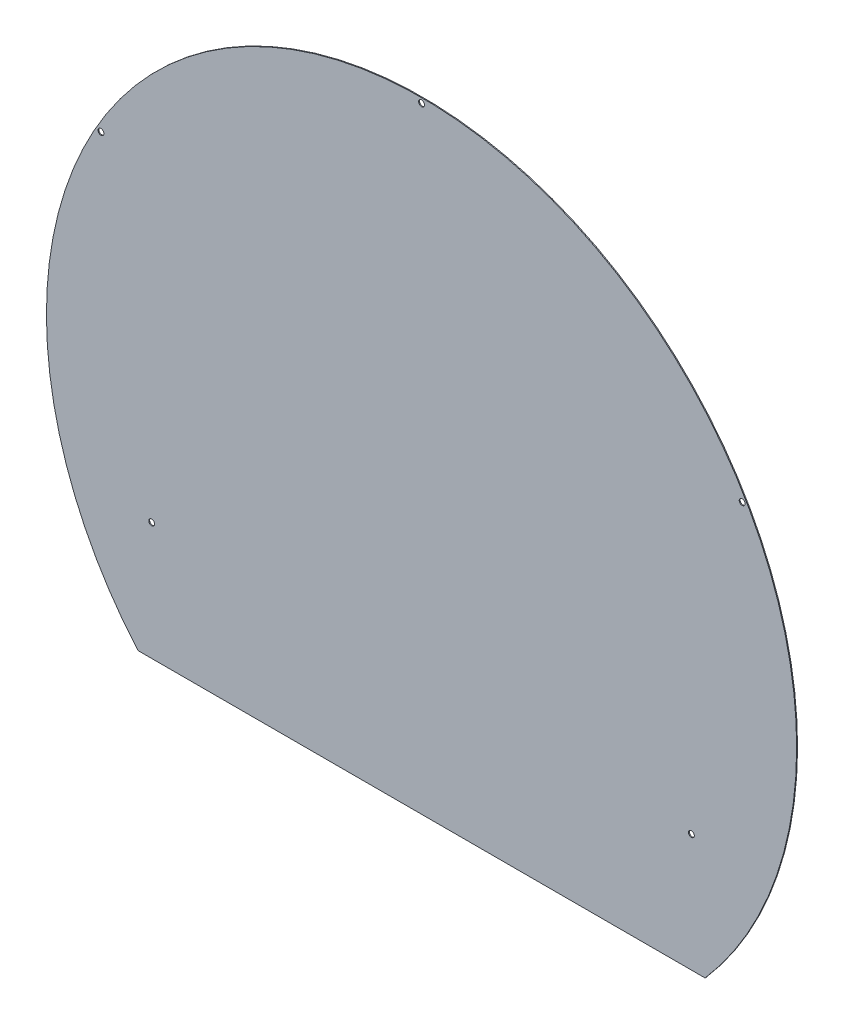
ISO-10303-21;
HEADER;
FILE_DESCRIPTION(('STEP AP214'),'2;1');
FILE_NAME('part.step','',(''),(''),'','','');
FILE_SCHEMA(('AUTOMOTIVE_DESIGN { 1 0 10303 214 1 1 1 1 }'));
ENDSEC;
DATA;
#1=APPLICATION_CONTEXT('core data for automotive mechanical design processes');
#2=APPLICATION_PROTOCOL_DEFINITION('international standard','automotive_design',2000,#1);
#3=PRODUCT_CONTEXT('',#1,'mechanical');
#4=PRODUCT('Part','Part','',(#3));
#5=PRODUCT_RELATED_PRODUCT_CATEGORY('part','',(#4));
#6=PRODUCT_DEFINITION_FORMATION('','',#4);
#7=PRODUCT_DEFINITION_CONTEXT('part definition',#1,'design');
#8=PRODUCT_DEFINITION('design','',#6,#7);
#9=PRODUCT_DEFINITION_SHAPE('','',#8);
#10=(LENGTH_UNIT() NAMED_UNIT(*) SI_UNIT(.MILLI.,.METRE.));
#11=(NAMED_UNIT(*) PLANE_ANGLE_UNIT() SI_UNIT($,.RADIAN.));
#12=(NAMED_UNIT(*) SI_UNIT($,.STERADIAN.) SOLID_ANGLE_UNIT());
#13=UNCERTAINTY_MEASURE_WITH_UNIT(LENGTH_MEASURE(1.E-05),#10,'distance_accuracy_value','');
#14=(GEOMETRIC_REPRESENTATION_CONTEXT(3) GLOBAL_UNCERTAINTY_ASSIGNED_CONTEXT((#13)) GLOBAL_UNIT_ASSIGNED_CONTEXT((#10,
#11,#12)) REPRESENTATION_CONTEXT('',''));
#15=CARTESIAN_POINT('',(0.,0.,0.));
#16=DIRECTION('',(0.,0.,1.));
#17=DIRECTION('',(1.,0.,0.));
#18=AXIS2_PLACEMENT_3D('',#15,#16,#17);
#19=CARTESIAN_POINT('',(0.,1.11022302462516E-13,1.));
#20=DIRECTION('',(0.,0.,-1.));
#21=DIRECTION('',(-1.,0.,0.));
#22=AXIS2_PLACEMENT_3D('',#19,#20,#21);
#23=PLANE('',#22);
#24=CARTESIAN_POINT('',(-300.,-141.999999999999,1.));
#25=DIRECTION('',(0.,0.,1.));
#26=DIRECTION('',(1.,0.,0.));
#27=AXIS2_PLACEMENT_3D('',#24,#25,#26);
#28=CIRCLE('',#27,3.25000000000001);
#29=CARTESIAN_POINT('',(-296.75,-141.999999999999,1.));
#30=VERTEX_POINT('',#29);
#31=EDGE_CURVE('E89',#30,#30,#28,.T.);
#32=ORIENTED_EDGE('',*,*,#31,.F.);
#33=EDGE_LOOP('',(#32));
#34=FACE_BOUND('',#33,.T.);
#35=CARTESIAN_POINT('',(356.369453657297,205.749999999999,1.));
#36=DIRECTION('',(0.,0.,1.));
#37=DIRECTION('',(1.,0.,0.));
#38=AXIS2_PLACEMENT_3D('',#35,#36,#37);
#39=CIRCLE('',#38,3.24999999999995);
#40=CARTESIAN_POINT('',(359.619453657297,205.749999999999,1.));
#41=VERTEX_POINT('',#40);
#42=EDGE_CURVE('E78',#41,#41,#39,.T.);
#43=ORIENTED_EDGE('',*,*,#42,.F.);
#44=EDGE_LOOP('',(#43));
#45=FACE_BOUND('',#44,.T.);
#46=CARTESIAN_POINT('',(0.,1.11022302462516E-13,1.));
#47=DIRECTION('',(0.,0.,1.));
#48=DIRECTION('',(-1.,0.,0.));
#49=AXIS2_PLACEMENT_3D('',#46,#47,#48);
#50=CIRCLE('',#49,417.);
#51=CARTESIAN_POINT('',(315.214212877529,-273.,1.));
#52=VERTEX_POINT('',#51);
#53=CARTESIAN_POINT('',(-315.214212877529,-273.,1.));
#54=VERTEX_POINT('',#53);
#55=EDGE_CURVE('E63',#52,#54,#50,.T.);
#56=ORIENTED_EDGE('',*,*,#55,.T.);
#57=DIRECTION('',(1.,0.,0.));
#58=VECTOR('',#57,1.);
#59=CARTESIAN_POINT('',(-315.214212877529,-273.,1.));
#60=LINE('',#59,#58);
#61=EDGE_CURVE('E48',#54,#52,#60,.T.);
#62=ORIENTED_EDGE('',*,*,#61,.T.);
#63=EDGE_LOOP('',(#56,#62));
#64=FACE_BOUND('',#63,.T.);
#65=CARTESIAN_POINT('',(0.,411.5,1.));
#66=DIRECTION('',(0.,0.,1.));
#67=DIRECTION('',(1.,0.,0.));
#68=AXIS2_PLACEMENT_3D('',#65,#66,#67);
#69=CIRCLE('',#68,3.25);
#70=CARTESIAN_POINT('',(3.25,411.5,1.));
#71=VERTEX_POINT('',#70);
#72=EDGE_CURVE('E69',#71,#71,#69,.T.);
#73=ORIENTED_EDGE('',*,*,#72,.F.);
#74=EDGE_LOOP('',(#73));
#75=FACE_BOUND('',#74,.T.);
#76=CARTESIAN_POINT('',(-356.369453657294,205.750000000004,1.));
#77=DIRECTION('',(0.,0.,1.));
#78=DIRECTION('',(1.,0.,0.));
#79=AXIS2_PLACEMENT_3D('',#76,#77,#78);
#80=CIRCLE('',#79,3.24999999999995);
#81=CARTESIAN_POINT('',(-353.119453657294,205.750000000004,1.));
#82=VERTEX_POINT('',#81);
#83=EDGE_CURVE('E83',#82,#82,#80,.T.);
#84=ORIENTED_EDGE('',*,*,#83,.F.);
#85=EDGE_LOOP('',(#84));
#86=FACE_BOUND('',#85,.T.);
#87=CARTESIAN_POINT('',(300.,-141.999999999999,1.));
#88=DIRECTION('',(0.,0.,1.));
#89=DIRECTION('',(1.,0.,0.));
#90=AXIS2_PLACEMENT_3D('',#87,#88,#89);
#91=CIRCLE('',#90,3.25000000000001);
#92=CARTESIAN_POINT('',(303.25,-141.999999999999,1.));
#93=VERTEX_POINT('',#92);
#94=EDGE_CURVE('E95',#93,#93,#91,.T.);
#95=ORIENTED_EDGE('',*,*,#94,.F.);
#96=EDGE_LOOP('',(#95));
#97=FACE_BOUND('',#96,.T.);
#98=ADVANCED_FACE('F32',(#34,#45,#64,#75,#86,#97),#23,.F.);
#99=CARTESIAN_POINT('',(0.,1.11022302462516E-13,0.));
#100=DIRECTION('',(0.,0.,-1.));
#101=DIRECTION('',(-1.,0.,0.));
#102=AXIS2_PLACEMENT_3D('',#99,#100,#101);
#103=PLANE('',#102);
#104=CARTESIAN_POINT('',(-300.,-141.999999999999,0.));
#105=DIRECTION('',(0.,0.,1.));
#106=DIRECTION('',(1.,0.,0.));
#107=AXIS2_PLACEMENT_3D('',#104,#105,#106);
#108=CIRCLE('',#107,3.25000000000001);
#109=CARTESIAN_POINT('',(-296.75,-141.999999999999,0.));
#110=VERTEX_POINT('',#109);
#111=EDGE_CURVE('E92',#110,#110,#108,.T.);
#112=ORIENTED_EDGE('',*,*,#111,.T.);
#113=EDGE_LOOP('',(#112));
#114=FACE_BOUND('',#113,.T.);
#115=CARTESIAN_POINT('',(356.369453657297,205.749999999999,0.));
#116=DIRECTION('',(0.,0.,1.));
#117=DIRECTION('',(1.,0.,0.));
#118=AXIS2_PLACEMENT_3D('',#115,#116,#117);
#119=CIRCLE('',#118,3.24999999999995);
#120=CARTESIAN_POINT('',(359.619453657297,205.749999999999,0.));
#121=VERTEX_POINT('',#120);
#122=EDGE_CURVE('E80',#121,#121,#119,.T.);
#123=ORIENTED_EDGE('',*,*,#122,.T.);
#124=EDGE_LOOP('',(#123));
#125=FACE_BOUND('',#124,.T.);
#126=CARTESIAN_POINT('',(0.,1.11022302462516E-13,0.));
#127=DIRECTION('',(0.,0.,1.));
#128=DIRECTION('',(-1.,0.,0.));
#129=AXIS2_PLACEMENT_3D('',#126,#127,#128);
#130=CIRCLE('',#129,417.);
#131=CARTESIAN_POINT('',(315.214212877529,-273.,0.));
#132=VERTEX_POINT('',#131);
#133=CARTESIAN_POINT('',(-315.214212877529,-273.,0.));
#134=VERTEX_POINT('',#133);
#135=EDGE_CURVE('E64',#132,#134,#130,.T.);
#136=ORIENTED_EDGE('',*,*,#135,.F.);
#137=DIRECTION('',(1.,0.,0.));
#138=VECTOR('',#137,1.);
#139=CARTESIAN_POINT('',(-315.214212877529,-273.,0.));
#140=LINE('',#139,#138);
#141=EDGE_CURVE('E56',#134,#132,#140,.T.);
#142=ORIENTED_EDGE('',*,*,#141,.F.);
#143=EDGE_LOOP('',(#136,#142));
#144=FACE_BOUND('',#143,.T.);
#145=CARTESIAN_POINT('',(0.,411.5,0.));
#146=DIRECTION('',(0.,0.,1.));
#147=DIRECTION('',(1.,0.,0.));
#148=AXIS2_PLACEMENT_3D('',#145,#146,#147);
#149=CIRCLE('',#148,3.25);
#150=CARTESIAN_POINT('',(3.25,411.5,0.));
#151=VERTEX_POINT('',#150);
#152=EDGE_CURVE('E72',#151,#151,#149,.T.);
#153=ORIENTED_EDGE('',*,*,#152,.T.);
#154=EDGE_LOOP('',(#153));
#155=FACE_BOUND('',#154,.T.);
#156=CARTESIAN_POINT('',(-356.369453657294,205.750000000004,0.));
#157=DIRECTION('',(0.,0.,1.));
#158=DIRECTION('',(1.,0.,0.));
#159=AXIS2_PLACEMENT_3D('',#156,#157,#158);
#160=CIRCLE('',#159,3.24999999999995);
#161=CARTESIAN_POINT('',(-353.119453657294,205.750000000004,0.));
#162=VERTEX_POINT('',#161);
#163=EDGE_CURVE('E86',#162,#162,#160,.T.);
#164=ORIENTED_EDGE('',*,*,#163,.T.);
#165=EDGE_LOOP('',(#164));
#166=FACE_BOUND('',#165,.T.);
#167=CARTESIAN_POINT('',(300.,-141.999999999999,0.));
#168=DIRECTION('',(0.,0.,1.));
#169=DIRECTION('',(1.,0.,0.));
#170=AXIS2_PLACEMENT_3D('',#167,#168,#169);
#171=CIRCLE('',#170,3.25000000000001);
#172=CARTESIAN_POINT('',(303.25,-141.999999999999,0.));
#173=VERTEX_POINT('',#172);
#174=EDGE_CURVE('E98',#173,#173,#171,.T.);
#175=ORIENTED_EDGE('',*,*,#174,.T.);
#176=EDGE_LOOP('',(#175));
#177=FACE_BOUND('',#176,.T.);
#178=ADVANCED_FACE('F67',(#114,#125,#144,#155,#166,#177),#103,.T.);
#179=CARTESIAN_POINT('',(0.,1.11022302462516E-13,1.));
#180=DIRECTION('',(0.,0.,-1.));
#181=DIRECTION('',(-1.,0.,0.));
#182=AXIS2_PLACEMENT_3D('',#179,#180,#181);
#183=CYLINDRICAL_SURFACE('',#182,417.);
#184=ORIENTED_EDGE('',*,*,#135,.T.);
#185=DIRECTION('',(0.,0.,-1.));
#186=VECTOR('',#185,1.);
#187=CARTESIAN_POINT('',(-315.214212877529,-273.,1.));
#188=LINE('',#187,#186);
#189=EDGE_CURVE('E11',#54,#134,#188,.T.);
#190=ORIENTED_EDGE('',*,*,#189,.F.);
#191=ORIENTED_EDGE('',*,*,#55,.F.);
#192=DIRECTION('',(0.,0.,-1.));
#193=VECTOR('',#192,1.);
#194=CARTESIAN_POINT('',(315.214212877529,-273.,1.));
#195=LINE('',#194,#193);
#196=EDGE_CURVE('E41',#52,#132,#195,.T.);
#197=ORIENTED_EDGE('',*,*,#196,.T.);
#198=EDGE_LOOP('',(#184,#190,#191,#197));
#199=FACE_BOUND('',#198,.T.);
#200=ADVANCED_FACE('F34',(#199),#183,.T.);
#201=CARTESIAN_POINT('',(-315.214212877529,-273.,1.));
#202=DIRECTION('',(0.,1.,0.));
#203=DIRECTION('',(0.,0.,1.));
#204=AXIS2_PLACEMENT_3D('',#201,#202,#203);
#205=PLANE('',#204);
#206=ORIENTED_EDGE('',*,*,#141,.T.);
#207=ORIENTED_EDGE('',*,*,#196,.F.);
#208=ORIENTED_EDGE('',*,*,#61,.F.);
#209=ORIENTED_EDGE('',*,*,#189,.T.);
#210=EDGE_LOOP('',(#206,#207,#208,#209));
#211=FACE_BOUND('',#210,.T.);
#212=ADVANCED_FACE('F59',(#211),#205,.F.);
#213=CARTESIAN_POINT('',(0.,411.5,1.));
#214=DIRECTION('',(0.,0.,-1.));
#215=DIRECTION('',(-1.,0.,0.));
#216=AXIS2_PLACEMENT_3D('',#213,#214,#215);
#217=CYLINDRICAL_SURFACE('',#216,3.25);
#218=ORIENTED_EDGE('',*,*,#72,.T.);
#219=EDGE_LOOP('',(#218));
#220=FACE_BOUND('',#219,.T.);
#221=ORIENTED_EDGE('',*,*,#152,.F.);
#222=EDGE_LOOP('',(#221));
#223=FACE_BOUND('',#222,.T.);
#224=ADVANCED_FACE('F118',(#220,#223),#217,.F.);
#225=CARTESIAN_POINT('',(356.369453657297,205.749999999999,1.));
#226=DIRECTION('',(0.,0.,-1.));
#227=DIRECTION('',(-1.,0.,0.));
#228=AXIS2_PLACEMENT_3D('',#225,#226,#227);
#229=CYLINDRICAL_SURFACE('',#228,3.24999999999995);
#230=ORIENTED_EDGE('',*,*,#42,.T.);
#231=EDGE_LOOP('',(#230));
#232=FACE_BOUND('',#231,.T.);
#233=ORIENTED_EDGE('',*,*,#122,.F.);
#234=EDGE_LOOP('',(#233));
#235=FACE_BOUND('',#234,.T.);
#236=ADVANCED_FACE('F125',(#232,#235),#229,.F.);
#237=CARTESIAN_POINT('',(-356.369453657294,205.750000000004,1.));
#238=DIRECTION('',(0.,0.,-1.));
#239=DIRECTION('',(-1.,0.,0.));
#240=AXIS2_PLACEMENT_3D('',#237,#238,#239);
#241=CYLINDRICAL_SURFACE('',#240,3.24999999999995);
#242=ORIENTED_EDGE('',*,*,#83,.T.);
#243=EDGE_LOOP('',(#242));
#244=FACE_BOUND('',#243,.T.);
#245=ORIENTED_EDGE('',*,*,#163,.F.);
#246=EDGE_LOOP('',(#245));
#247=FACE_BOUND('',#246,.T.);
#248=ADVANCED_FACE('F158',(#244,#247),#241,.F.);
#249=CARTESIAN_POINT('',(-300.,-141.999999999999,1.));
#250=DIRECTION('',(0.,0.,-1.));
#251=DIRECTION('',(-1.,0.,0.));
#252=AXIS2_PLACEMENT_3D('',#249,#250,#251);
#253=CYLINDRICAL_SURFACE('',#252,3.25000000000001);
#254=ORIENTED_EDGE('',*,*,#31,.T.);
#255=EDGE_LOOP('',(#254));
#256=FACE_BOUND('',#255,.T.);
#257=ORIENTED_EDGE('',*,*,#111,.F.);
#258=EDGE_LOOP('',(#257));
#259=FACE_BOUND('',#258,.T.);
#260=ADVANCED_FACE('F166',(#256,#259),#253,.F.);
#261=CARTESIAN_POINT('',(300.,-141.999999999999,1.));
#262=DIRECTION('',(0.,0.,-1.));
#263=DIRECTION('',(-1.,0.,0.));
#264=AXIS2_PLACEMENT_3D('',#261,#262,#263);
#265=CYLINDRICAL_SURFACE('',#264,3.25000000000001);
#266=ORIENTED_EDGE('',*,*,#94,.T.);
#267=EDGE_LOOP('',(#266));
#268=FACE_BOUND('',#267,.T.);
#269=ORIENTED_EDGE('',*,*,#174,.F.);
#270=EDGE_LOOP('',(#269));
#271=FACE_BOUND('',#270,.T.);
#272=ADVANCED_FACE('F104',(#268,#271),#265,.F.);
#273=CLOSED_SHELL('',(#98,#178,#200,#212,#224,#236,#248,#260,#272));
#274=MANIFOLD_SOLID_BREP('B2',#273);
#275=ADVANCED_BREP_SHAPE_REPRESENTATION('',(#18,#274),#14);
#276=SHAPE_DEFINITION_REPRESENTATION(#9,#275);
ENDSEC;
END-ISO-10303-21;
